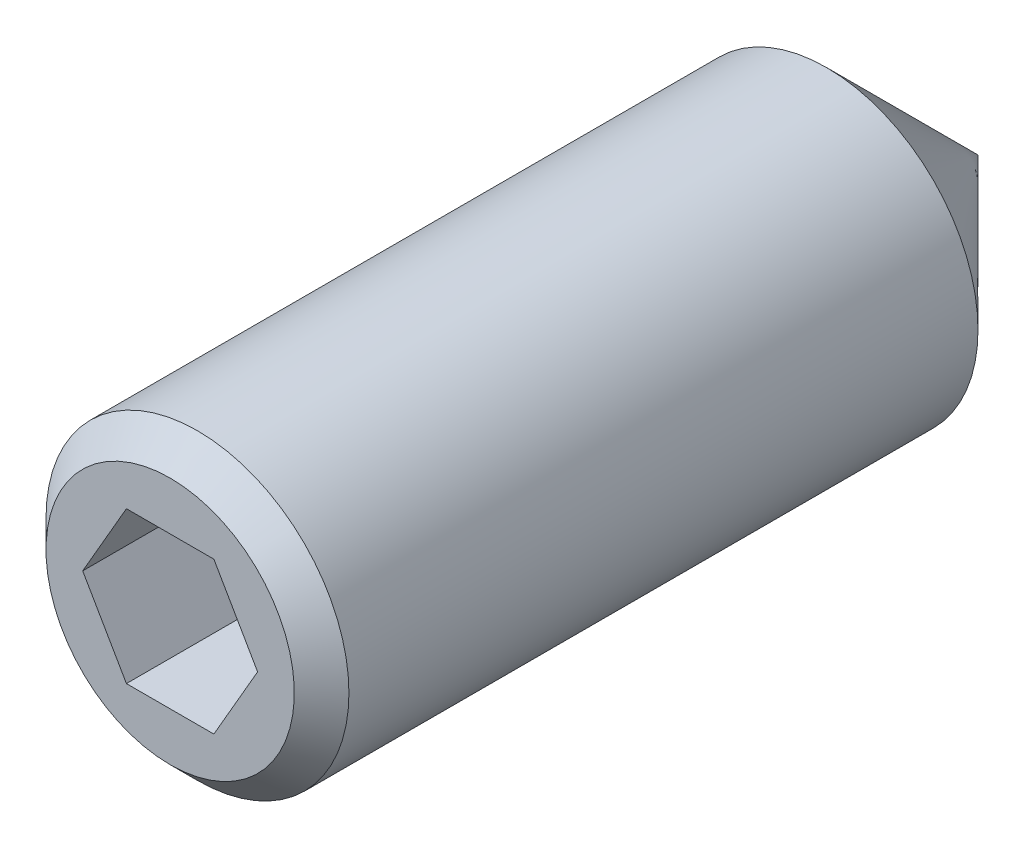
ISO-10303-21;
HEADER;
FILE_DESCRIPTION(('STEP AP214'),'2;1');
FILE_NAME('part.step','',(''),(''),'','','');
FILE_SCHEMA(('AUTOMOTIVE_DESIGN { 1 0 10303 214 1 1 1 1 }'));
ENDSEC;
DATA;
#1=APPLICATION_CONTEXT('core data for automotive mechanical design processes');
#2=APPLICATION_PROTOCOL_DEFINITION('international standard','automotive_design',2000,#1);
#3=PRODUCT_CONTEXT('',#1,'mechanical');
#4=PRODUCT('Part','Part','',(#3));
#5=PRODUCT_RELATED_PRODUCT_CATEGORY('part','',(#4));
#6=PRODUCT_DEFINITION_FORMATION('','',#4);
#7=PRODUCT_DEFINITION_CONTEXT('part definition',#1,'design');
#8=PRODUCT_DEFINITION('design','',#6,#7);
#9=PRODUCT_DEFINITION_SHAPE('','',#8);
#10=(LENGTH_UNIT() NAMED_UNIT(*) SI_UNIT(.MILLI.,.METRE.));
#11=(NAMED_UNIT(*) PLANE_ANGLE_UNIT() SI_UNIT($,.RADIAN.));
#12=(NAMED_UNIT(*) SI_UNIT($,.STERADIAN.) SOLID_ANGLE_UNIT());
#13=UNCERTAINTY_MEASURE_WITH_UNIT(LENGTH_MEASURE(1.E-05),#10,'distance_accuracy_value','');
#14=(GEOMETRIC_REPRESENTATION_CONTEXT(3) GLOBAL_UNCERTAINTY_ASSIGNED_CONTEXT((#13)) GLOBAL_UNIT_ASSIGNED_CONTEXT((#10,
#11,#12)) REPRESENTATION_CONTEXT('',''));
#15=CARTESIAN_POINT('',(0.,0.,0.));
#16=DIRECTION('',(0.,0.,1.));
#17=DIRECTION('',(1.,0.,0.));
#18=AXIS2_PLACEMENT_3D('',#15,#16,#17);
#19=CARTESIAN_POINT('',(0.,0.,-2.24999988343748));
#20=DIRECTION('',(0.,0.,1.));
#21=DIRECTION('',(0.,1.,0.));
#22=AXIS2_PLACEMENT_3D('',#19,#20,#21);
#23=CONICAL_SURFACE('',#22,0.4330125,1.0471975511966);
#24=CARTESIAN_POINT('',(0.4330125,0.749999650312421,-2.));
#25=CARTESIAN_POINT('',(0.64951875,0.374999825156212,-2.12499994171874));
#26=CARTESIAN_POINT('',(0.866025,0.,-2.));
#27=(BOUNDED_CURVE() B_SPLINE_CURVE(2,(#24,#25,#26),.UNSPECIFIED.,.F.,
.F.) B_SPLINE_CURVE_WITH_KNOTS((3,3),(0.,0.876326694970838),
.UNSPECIFIED.) CURVE() GEOMETRIC_REPRESENTATION_ITEM() RATIONAL_B_SPLINE_CURVE((1.,
1.15470053837924,1.)) REPRESENTATION_ITEM(''));
#28=CARTESIAN_POINT('',(0.4330125,0.749999650312419,-2.));
#29=VERTEX_POINT('',#28);
#30=CARTESIAN_POINT('',(0.866025,0.,-2.));
#31=VERTEX_POINT('',#30);
#32=EDGE_CURVE('E118',#29,#31,#27,.T.);
#33=ORIENTED_EDGE('',*,*,#32,.F.);
#34=CARTESIAN_POINT('',(-0.4330125,0.749999650312418,-2.));
#35=CARTESIAN_POINT('',(0.,0.749999650312413,-2.12499994171874));
#36=CARTESIAN_POINT('',(0.4330125,0.749999650312419,-2.));
#37=(BOUNDED_CURVE() B_SPLINE_CURVE(2,(#34,#35,#36),.UNSPECIFIED.,.F.,
.F.) B_SPLINE_CURVE_WITH_KNOTS((3,3),(0.,0.876326694970839),
.UNSPECIFIED.) CURVE() GEOMETRIC_REPRESENTATION_ITEM() RATIONAL_B_SPLINE_CURVE((1.,
1.15470053837926,1.)) REPRESENTATION_ITEM(''));
#38=CARTESIAN_POINT('',(-0.4330125,0.749999650312418,-2.));
#39=VERTEX_POINT('',#38);
#40=EDGE_CURVE('E41',#39,#29,#37,.T.);
#41=ORIENTED_EDGE('',*,*,#40,.F.);
#42=CARTESIAN_POINT('',(-0.866025,0.,-2.));
#43=CARTESIAN_POINT('',(-0.649518749999999,0.374999825156212,-2.12499994171874));
#44=CARTESIAN_POINT('',(-0.4330125,0.749999650312421,-2.));
#45=(BOUNDED_CURVE() B_SPLINE_CURVE(2,(#42,#43,#44),.UNSPECIFIED.,.F.,
.F.) B_SPLINE_CURVE_WITH_KNOTS((3,3),(0.,0.876326694970838),
.UNSPECIFIED.) CURVE() GEOMETRIC_REPRESENTATION_ITEM() RATIONAL_B_SPLINE_CURVE((1.,
1.15470053837924,1.)) REPRESENTATION_ITEM(''));
#46=CARTESIAN_POINT('',(-0.866025,0.,-2.));
#47=VERTEX_POINT('',#46);
#48=EDGE_CURVE('E177',#47,#39,#45,.T.);
#49=ORIENTED_EDGE('',*,*,#48,.F.);
#50=CARTESIAN_POINT('',(-0.4330125,-0.749999650312422,-2.));
#51=CARTESIAN_POINT('',(-0.649518749999999,-0.374999825156212,-2.12499994171874));
#52=CARTESIAN_POINT('',(-0.866025,0.,-2.));
#53=(BOUNDED_CURVE() B_SPLINE_CURVE(2,(#50,#51,#52),.UNSPECIFIED.,.F.,
.F.) B_SPLINE_CURVE_WITH_KNOTS((3,3),(0.,0.876326694970838),
.UNSPECIFIED.) CURVE() GEOMETRIC_REPRESENTATION_ITEM() RATIONAL_B_SPLINE_CURVE((1.,
1.15470053837924,1.)) REPRESENTATION_ITEM(''));
#54=CARTESIAN_POINT('',(-0.4330125,-0.749999650312419,-2.));
#55=VERTEX_POINT('',#54);
#56=EDGE_CURVE('E12',#55,#47,#53,.T.);
#57=ORIENTED_EDGE('',*,*,#56,.F.);
#58=CARTESIAN_POINT('',(0.4330125,-0.749999650312419,-2.));
#59=CARTESIAN_POINT('',(0.,-0.749999650312423,-2.12499994171874));
#60=CARTESIAN_POINT('',(-0.4330125,-0.749999650312419,-2.));
#61=(BOUNDED_CURVE() B_SPLINE_CURVE(2,(#58,#59,#60),.UNSPECIFIED.,.F.,
.F.) B_SPLINE_CURVE_WITH_KNOTS((3,3),(0.,0.876326694970838),
.UNSPECIFIED.) CURVE() GEOMETRIC_REPRESENTATION_ITEM() RATIONAL_B_SPLINE_CURVE((1.,
1.15470053837924,1.)) REPRESENTATION_ITEM(''));
#62=CARTESIAN_POINT('',(0.4330125,-0.749999650312419,-2.));
#63=VERTEX_POINT('',#62);
#64=EDGE_CURVE('E135',#63,#55,#61,.T.);
#65=ORIENTED_EDGE('',*,*,#64,.F.);
#66=CARTESIAN_POINT('',(0.866025,0.,-2.));
#67=CARTESIAN_POINT('',(0.64951875,-0.374999825156207,-2.12499994171874));
#68=CARTESIAN_POINT('',(0.4330125,-0.749999650312421,-2.));
#69=(BOUNDED_CURVE() B_SPLINE_CURVE(2,(#66,#67,#68),.UNSPECIFIED.,.F.,
.F.) B_SPLINE_CURVE_WITH_KNOTS((3,3),(0.,0.876326694970837),
.UNSPECIFIED.) CURVE() GEOMETRIC_REPRESENTATION_ITEM() RATIONAL_B_SPLINE_CURVE((1.,
1.15470053837926,1.)) REPRESENTATION_ITEM(''));
#70=EDGE_CURVE('E23',#31,#63,#69,.T.);
#71=ORIENTED_EDGE('',*,*,#70,.F.);
#72=EDGE_LOOP('',(#33,#41,#49,#57,#65,#71));
#73=FACE_BOUND('',#72,.T.);
#74=CARTESIAN_POINT('',(0.,0.,-2.49999976687495));
#75=VERTEX_POINT('',#74);
#76=VERTEX_LOOP('',#75);
#77=FACE_BOUND('',#76,.T.);
#78=ADVANCED_FACE('F19',(#73,#77),#23,.F.);
#79=CARTESIAN_POINT('',(-0.64951875,-0.374999825156209,0.));
#80=DIRECTION('',(-0.866025403784439,-0.5,0.));
#81=DIRECTION('',(-0.5,0.866025403784439,0.));
#82=AXIS2_PLACEMENT_3D('',#79,#80,#81);
#83=PLANE('',#82);
#84=ORIENTED_EDGE('',*,*,#56,.T.);
#85=DIRECTION('',(0.,0.,-1.));
#86=VECTOR('',#85,1.);
#87=CARTESIAN_POINT('',(-0.866025,0.,0.));
#88=LINE('',#87,#86);
#89=CARTESIAN_POINT('',(-0.866025,0.,0.));
#90=VERTEX_POINT('',#89);
#91=EDGE_CURVE('E112',#90,#47,#88,.T.);
#92=ORIENTED_EDGE('',*,*,#91,.F.);
#93=DIRECTION('',(-0.5,0.866025403784439,0.));
#94=VECTOR('',#93,1.);
#95=CARTESIAN_POINT('',(-0.782602497597187,-0.144492012656209,0.));
#96=LINE('',#95,#94);
#97=CARTESIAN_POINT('',(-0.4330125,-0.749999650312419,0.));
#98=VERTEX_POINT('',#97);
#99=EDGE_CURVE('E108',#98,#90,#96,.T.);
#100=ORIENTED_EDGE('',*,*,#99,.F.);
#101=DIRECTION('',(0.,0.,-1.));
#102=VECTOR('',#101,1.);
#103=CARTESIAN_POINT('',(-0.4330125,-0.749999650312419,0.));
#104=LINE('',#103,#102);
#105=EDGE_CURVE('E32',#98,#55,#104,.T.);
#106=ORIENTED_EDGE('',*,*,#105,.T.);
#107=EDGE_LOOP('',(#84,#92,#100,#106));
#108=FACE_BOUND('',#107,.T.);
#109=ADVANCED_FACE('F161',(#108),#83,.F.);
#110=CARTESIAN_POINT('',(0.,-0.749999650312419,0.));
#111=DIRECTION('',(0.,-1.,0.));
#112=DIRECTION('',(-1.,0.,0.));
#113=AXIS2_PLACEMENT_3D('',#110,#111,#112);
#114=PLANE('',#113);
#115=ORIENTED_EDGE('',*,*,#64,.T.);
#116=ORIENTED_EDGE('',*,*,#105,.F.);
#117=DIRECTION('',(-1.,0.,0.));
#118=VECTOR('',#117,1.);
#119=CARTESIAN_POINT('',(0.,-0.749999650312419,0.));
#120=LINE('',#119,#118);
#121=CARTESIAN_POINT('',(0.4330125,-0.749999650312419,0.));
#122=VERTEX_POINT('',#121);
#123=EDGE_CURVE('E95',#122,#98,#120,.T.);
#124=ORIENTED_EDGE('',*,*,#123,.F.);
#125=DIRECTION('',(0.,0.,-1.));
#126=VECTOR('',#125,1.);
#127=CARTESIAN_POINT('',(0.4330125,-0.749999650312419,0.));
#128=LINE('',#127,#126);
#129=EDGE_CURVE('E139',#122,#63,#128,.T.);
#130=ORIENTED_EDGE('',*,*,#129,.T.);
#131=EDGE_LOOP('',(#115,#116,#124,#130));
#132=FACE_BOUND('',#131,.T.);
#133=ADVANCED_FACE('F167',(#132),#114,.F.);
#134=CARTESIAN_POINT('',(0.64951875,-0.374999825156209,0.));
#135=DIRECTION('',(0.866025403784439,-0.5,0.));
#136=DIRECTION('',(-0.5,-0.866025403784439,0.));
#137=AXIS2_PLACEMENT_3D('',#134,#135,#136);
#138=PLANE('',#137);
#139=ORIENTED_EDGE('',*,*,#70,.T.);
#140=ORIENTED_EDGE('',*,*,#129,.F.);
#141=DIRECTION('',(-0.5,-0.866025403784439,0.));
#142=VECTOR('',#141,1.);
#143=CARTESIAN_POINT('',(0.782602497597187,-0.144492012656209,0.));
#144=LINE('',#143,#142);
#145=CARTESIAN_POINT('',(0.866025,0.,0.));
#146=VERTEX_POINT('',#145);
#147=EDGE_CURVE('E154',#146,#122,#144,.T.);
#148=ORIENTED_EDGE('',*,*,#147,.F.);
#149=DIRECTION('',(0.,0.,-1.));
#150=VECTOR('',#149,1.);
#151=CARTESIAN_POINT('',(0.866025,0.,0.));
#152=LINE('',#151,#150);
#153=EDGE_CURVE('E123',#146,#31,#152,.T.);
#154=ORIENTED_EDGE('',*,*,#153,.T.);
#155=EDGE_LOOP('',(#139,#140,#148,#154));
#156=FACE_BOUND('',#155,.T.);
#157=ADVANCED_FACE('F207',(#156),#138,.F.);
#158=CARTESIAN_POINT('',(0.64951875,0.374999825156209,0.));
#159=DIRECTION('',(0.866025403784439,0.5,0.));
#160=DIRECTION('',(0.5,-0.866025403784439,0.));
#161=AXIS2_PLACEMENT_3D('',#158,#159,#160);
#162=PLANE('',#161);
#163=ORIENTED_EDGE('',*,*,#32,.T.);
#164=ORIENTED_EDGE('',*,*,#153,.F.);
#165=DIRECTION('',(0.5,-0.866025403784439,0.));
#166=VECTOR('',#165,1.);
#167=CARTESIAN_POINT('',(0.516435002402813,0.605507637656209,0.));
#168=LINE('',#167,#166);
#169=CARTESIAN_POINT('',(0.4330125,0.749999650312419,0.));
#170=VERTEX_POINT('',#169);
#171=EDGE_CURVE('E151',#170,#146,#168,.T.);
#172=ORIENTED_EDGE('',*,*,#171,.F.);
#173=DIRECTION('',(0.,0.,-1.));
#174=VECTOR('',#173,1.);
#175=CARTESIAN_POINT('',(0.4330125,0.749999650312419,0.));
#176=LINE('',#175,#174);
#177=EDGE_CURVE('E124',#170,#29,#176,.T.);
#178=ORIENTED_EDGE('',*,*,#177,.T.);
#179=EDGE_LOOP('',(#163,#164,#172,#178));
#180=FACE_BOUND('',#179,.T.);
#181=ADVANCED_FACE('F193',(#180),#162,.F.);
#182=CARTESIAN_POINT('',(0.,0.749999650312418,0.));
#183=DIRECTION('',(0.,1.,0.));
#184=DIRECTION('',(1.,0.,0.));
#185=AXIS2_PLACEMENT_3D('',#182,#183,#184);
#186=PLANE('',#185);
#187=ORIENTED_EDGE('',*,*,#40,.T.);
#188=ORIENTED_EDGE('',*,*,#177,.F.);
#189=DIRECTION('',(1.,0.,0.));
#190=VECTOR('',#189,1.);
#191=CARTESIAN_POINT('',(0.,0.749999650312419,0.));
#192=LINE('',#191,#190);
#193=CARTESIAN_POINT('',(-0.4330125,0.749999650312418,0.));
#194=VERTEX_POINT('',#193);
#195=EDGE_CURVE('E147',#194,#170,#192,.T.);
#196=ORIENTED_EDGE('',*,*,#195,.F.);
#197=DIRECTION('',(0.,0.,-1.));
#198=VECTOR('',#197,1.);
#199=CARTESIAN_POINT('',(-0.4330125,0.749999650312418,0.));
#200=LINE('',#199,#198);
#201=EDGE_CURVE('E176',#194,#39,#200,.T.);
#202=ORIENTED_EDGE('',*,*,#201,.T.);
#203=EDGE_LOOP('',(#187,#188,#196,#202));
#204=FACE_BOUND('',#203,.T.);
#205=ADVANCED_FACE('F187',(#204),#186,.F.);
#206=CARTESIAN_POINT('',(-0.64951875,0.374999825156209,0.));
#207=DIRECTION('',(-0.866025403784439,0.5,0.));
#208=DIRECTION('',(0.5,0.866025403784439,0.));
#209=AXIS2_PLACEMENT_3D('',#206,#207,#208);
#210=PLANE('',#209);
#211=ORIENTED_EDGE('',*,*,#48,.T.);
#212=ORIENTED_EDGE('',*,*,#201,.F.);
#213=DIRECTION('',(0.5,0.866025403784439,0.));
#214=VECTOR('',#213,1.);
#215=CARTESIAN_POINT('',(-0.516435002402814,0.605507637656209,0.));
#216=LINE('',#215,#214);
#217=EDGE_CURVE('E113',#90,#194,#216,.T.);
#218=ORIENTED_EDGE('',*,*,#217,.F.);
#219=ORIENTED_EDGE('',*,*,#91,.T.);
#220=EDGE_LOOP('',(#211,#212,#218,#219));
#221=FACE_BOUND('',#220,.T.);
#222=ADVANCED_FACE('F21',(#221),#210,.F.);
#223=CARTESIAN_POINT('',(0.,0.6146875,0.));
#224=DIRECTION('',(0.,0.,1.));
#225=DIRECTION('',(0.,-1.,0.));
#226=AXIS2_PLACEMENT_3D('',#223,#224,#225);
#227=PLANE('',#226);
#228=ORIENTED_EDGE('',*,*,#99,.T.);
#229=ORIENTED_EDGE('',*,*,#217,.T.);
#230=ORIENTED_EDGE('',*,*,#195,.T.);
#231=ORIENTED_EDGE('',*,*,#171,.T.);
#232=ORIENTED_EDGE('',*,*,#147,.T.);
#233=ORIENTED_EDGE('',*,*,#123,.T.);
#234=EDGE_LOOP('',(#228,#229,#230,#231,#232,#233));
#235=FACE_BOUND('',#234,.T.);
#236=CARTESIAN_POINT('',(0.,0.,0.));
#237=DIRECTION('',(0.,0.,-1.));
#238=DIRECTION('',(0.,1.,0.));
#239=AXIS2_PLACEMENT_3D('',#236,#237,#238);
#240=CIRCLE('',#239,1.229375);
#241=CARTESIAN_POINT('',(0.,1.229375,0.));
#242=VERTEX_POINT('',#241);
#243=EDGE_CURVE('E91',#242,#242,#240,.T.);
#244=ORIENTED_EDGE('',*,*,#243,.F.);
#245=EDGE_LOOP('',(#244));
#246=FACE_BOUND('',#245,.T.);
#247=ADVANCED_FACE('F172',(#235,#246),#227,.T.);
#248=CARTESIAN_POINT('',(0.,0.,-0.1353125));
#249=DIRECTION('',(0.,0.,-1.));
#250=DIRECTION('',(0.,1.,0.));
#251=AXIS2_PLACEMENT_3D('',#248,#249,#250);
#252=CONICAL_SURFACE('',#251,1.3646875,0.785398163397448);
#253=CARTESIAN_POINT('',(0.,0.,-0.270625));
#254=DIRECTION('',(0.,0.,-1.));
#255=DIRECTION('',(0.,1.,0.));
#256=AXIS2_PLACEMENT_3D('',#253,#254,#255);
#257=CIRCLE('',#256,1.5);
#258=CARTESIAN_POINT('',(0.,1.5,-0.270625));
#259=VERTEX_POINT('',#258);
#260=EDGE_CURVE('E87',#259,#259,#257,.T.);
#261=ORIENTED_EDGE('',*,*,#260,.F.);
#262=EDGE_LOOP('',(#261));
#263=FACE_BOUND('',#262,.T.);
#264=ORIENTED_EDGE('',*,*,#243,.T.);
#265=EDGE_LOOP('',(#264));
#266=FACE_BOUND('',#265,.T.);
#267=ADVANCED_FACE('F88',(#263,#266),#252,.T.);
#268=CARTESIAN_POINT('',(0.,0.,-3.3853125));
#269=DIRECTION('',(0.,0.,1.));
#270=DIRECTION('',(0.,1.,0.));
#271=AXIS2_PLACEMENT_3D('',#268,#269,#270);
#272=CYLINDRICAL_SURFACE('',#271,1.5);
#273=CARTESIAN_POINT('',(0.,0.,-6.5));
#274=DIRECTION('',(0.,0.,-1.));
#275=DIRECTION('',(0.,1.,0.));
#276=AXIS2_PLACEMENT_3D('',#273,#274,#275);
#277=CIRCLE('',#276,1.5);
#278=CARTESIAN_POINT('',(0.,1.5,-6.5));
#279=VERTEX_POINT('',#278);
#280=EDGE_CURVE('E92',#279,#279,#277,.T.);
#281=ORIENTED_EDGE('',*,*,#280,.F.);
#282=EDGE_LOOP('',(#281));
#283=FACE_BOUND('',#282,.T.);
#284=ORIENTED_EDGE('',*,*,#260,.T.);
#285=EDGE_LOOP('',(#284));
#286=FACE_BOUND('',#285,.T.);
#287=ADVANCED_FACE('F214',(#283,#286),#272,.T.);
#288=CARTESIAN_POINT('',(0.,0.,-7.25));
#289=DIRECTION('',(0.,0.,1.));
#290=DIRECTION('',(0.,1.,0.));
#291=AXIS2_PLACEMENT_3D('',#288,#289,#290);
#292=CONICAL_SURFACE('',#291,0.75,0.785398163397449);
#293=CARTESIAN_POINT('',(0.,0.,-8.));
#294=VERTEX_POINT('',#293);
#295=VERTEX_LOOP('',#294);
#296=FACE_BOUND('',#295,.T.);
#297=ORIENTED_EDGE('',*,*,#280,.T.);
#298=EDGE_LOOP('',(#297));
#299=FACE_BOUND('',#298,.T.);
#300=ADVANCED_FACE('F217',(#296,#299),#292,.T.);
#301=CLOSED_SHELL('',(#78,#109,#133,#157,#181,#205,#222,#247,#267,#287,#300));
#302=MANIFOLD_SOLID_BREP('B1',#301);
#303=ADVANCED_BREP_SHAPE_REPRESENTATION('',(#18,#302),#14);
#304=SHAPE_DEFINITION_REPRESENTATION(#9,#303);
ENDSEC;
END-ISO-10303-21;
